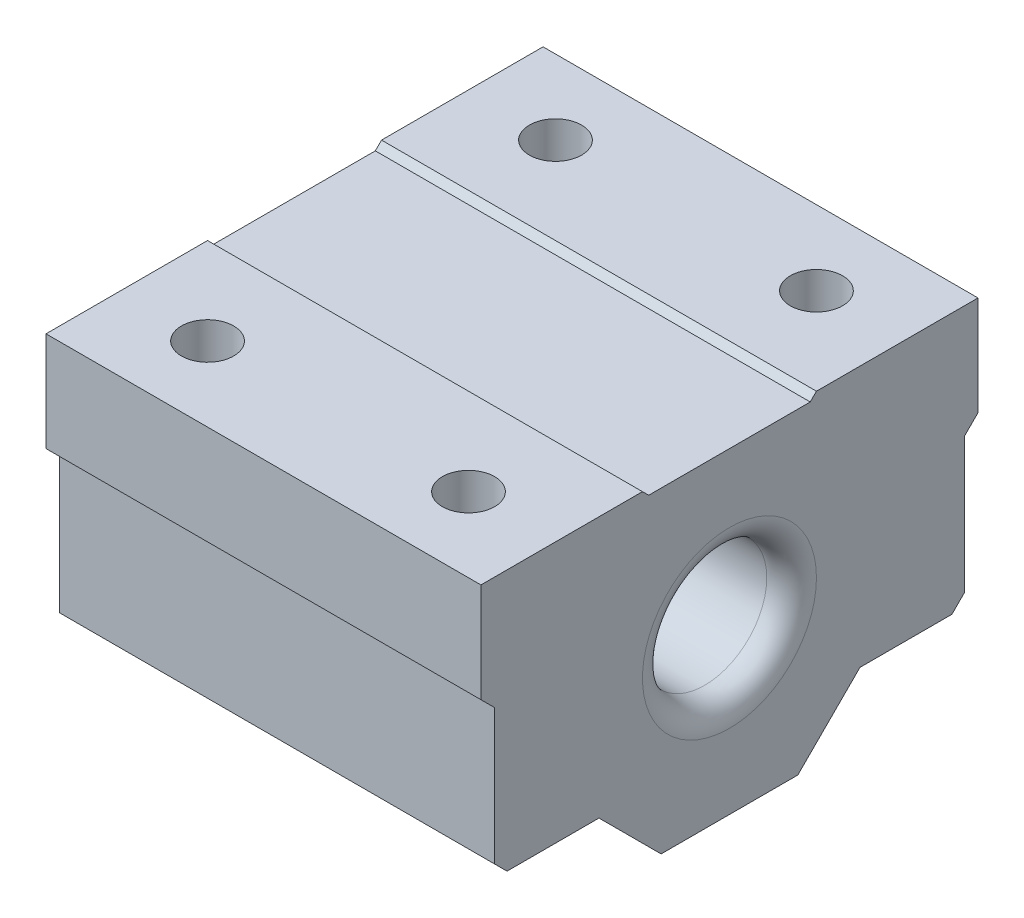
ISO-10303-21;
HEADER;
FILE_DESCRIPTION(('STEP AP214'),'2;1');
FILE_NAME('part.step','',(''),(''),'','','');
FILE_SCHEMA(('AUTOMOTIVE_DESIGN { 1 0 10303 214 1 1 1 1 }'));
ENDSEC;
DATA;
#1=APPLICATION_CONTEXT('core data for automotive mechanical design processes');
#2=APPLICATION_PROTOCOL_DEFINITION('international standard','automotive_design',2000,#1);
#3=PRODUCT_CONTEXT('',#1,'mechanical');
#4=PRODUCT('Part','Part','',(#3));
#5=PRODUCT_RELATED_PRODUCT_CATEGORY('part','',(#4));
#6=PRODUCT_DEFINITION_FORMATION('','',#4);
#7=PRODUCT_DEFINITION_CONTEXT('part definition',#1,'design');
#8=PRODUCT_DEFINITION('design','',#6,#7);
#9=PRODUCT_DEFINITION_SHAPE('','',#8);
#10=(LENGTH_UNIT() NAMED_UNIT(*) SI_UNIT(.MILLI.,.METRE.));
#11=(NAMED_UNIT(*) PLANE_ANGLE_UNIT() SI_UNIT($,.RADIAN.));
#12=(NAMED_UNIT(*) SI_UNIT($,.STERADIAN.) SOLID_ANGLE_UNIT());
#13=UNCERTAINTY_MEASURE_WITH_UNIT(LENGTH_MEASURE(1.E-05),#10,'distance_accuracy_value','');
#14=(GEOMETRIC_REPRESENTATION_CONTEXT(3) GLOBAL_UNCERTAINTY_ASSIGNED_CONTEXT((#13)) GLOBAL_UNIT_ASSIGNED_CONTEXT((#10,
#11,#12)) REPRESENTATION_CONTEXT('',''));
#15=CARTESIAN_POINT('',(0.,0.,0.));
#16=DIRECTION('',(0.,0.,1.));
#17=DIRECTION('',(1.,0.,0.));
#18=AXIS2_PLACEMENT_3D('',#15,#16,#17);
#19=CARTESIAN_POINT('',(35.,0.,0.));
#20=DIRECTION('',(1.,0.,0.));
#21=DIRECTION('',(0.,0.,-1.));
#22=AXIS2_PLACEMENT_3D('',#19,#20,#21);
#23=PLANE('',#22);
#24=CARTESIAN_POINT('',(35.,13.,-20.));
#25=DIRECTION('',(1.,0.,0.));
#26=DIRECTION('',(0.,0.,-1.));
#27=AXIS2_PLACEMENT_3D('',#24,#25,#26);
#28=CIRCLE('',#27,7.);
#29=CARTESIAN_POINT('',(35.,13.,-27.));
#30=VERTEX_POINT('',#29);
#31=EDGE_CURVE('E11',#30,#30,#28,.F.);
#32=ORIENTED_EDGE('',*,*,#31,.T.);
#33=EDGE_LOOP('',(#32));
#34=FACE_BOUND('',#33,.T.);
#35=DIRECTION('',(0.,0.,1.));
#36=VECTOR('',#35,1.);
#37=CARTESIAN_POINT('',(35.,26.,0.));
#38=LINE('',#37,#36);
#39=CARTESIAN_POINT('',(35.,26.,-13.));
#40=VERTEX_POINT('',#39);
#41=CARTESIAN_POINT('',(35.,26.,0.));
#42=VERTEX_POINT('',#41);
#43=EDGE_CURVE('E259',#40,#42,#38,.T.);
#44=ORIENTED_EDGE('',*,*,#43,.T.);
#45=DIRECTION('',(0.,-1.,0.));
#46=VECTOR('',#45,1.);
#47=CARTESIAN_POINT('',(35.,18.,0.));
#48=LINE('',#47,#46);
#49=CARTESIAN_POINT('',(35.,18.,0.));
#50=VERTEX_POINT('',#49);
#51=EDGE_CURVE('E135',#42,#50,#48,.T.);
#52=ORIENTED_EDGE('',*,*,#51,.T.);
#53=DIRECTION('',(0.,-0.707106781186546,-0.707106781186549));
#54=VECTOR('',#53,1.);
#55=CARTESIAN_POINT('',(35.,18.,0.));
#56=LINE('',#55,#54);
#57=CARTESIAN_POINT('',(35.,16.9,-1.1));
#58=VERTEX_POINT('',#57);
#59=EDGE_CURVE('E444',#50,#58,#56,.T.);
#60=ORIENTED_EDGE('',*,*,#59,.T.);
#61=DIRECTION('',(0.,-1.,0.));
#62=VECTOR('',#61,1.);
#63=CARTESIAN_POINT('',(35.,16.9,-1.1));
#64=LINE('',#63,#62);
#65=CARTESIAN_POINT('',(35.,6.,-1.1));
#66=VERTEX_POINT('',#65);
#67=EDGE_CURVE('E447',#58,#66,#64,.T.);
#68=ORIENTED_EDGE('',*,*,#67,.T.);
#69=DIRECTION('',(0.,-0.707106781186548,-0.707106781186547));
#70=VECTOR('',#69,1.);
#71=CARTESIAN_POINT('',(35.,6.,-1.1));
#72=LINE('',#71,#70);
#73=CARTESIAN_POINT('',(35.,5.,-2.1));
#74=VERTEX_POINT('',#73);
#75=EDGE_CURVE('E450',#66,#74,#72,.T.);
#76=ORIENTED_EDGE('',*,*,#75,.T.);
#77=DIRECTION('',(0.,0.,-1.));
#78=VECTOR('',#77,1.);
#79=CARTESIAN_POINT('',(35.,5.,-2.1));
#80=LINE('',#79,#78);
#81=CARTESIAN_POINT('',(35.,4.99999999999999,-9.50000000000003));
#82=VERTEX_POINT('',#81);
#83=EDGE_CURVE('E453',#74,#82,#80,.T.);
#84=ORIENTED_EDGE('',*,*,#83,.T.);
#85=DIRECTION('',(0.,-0.707106781186549,-0.707106781186546));
#86=VECTOR('',#85,1.);
#87=CARTESIAN_POINT('',(35.,4.99999999999999,-9.50000000000003));
#88=LINE('',#87,#86);
#89=CARTESIAN_POINT('',(35.,0.,-14.5));
#90=VERTEX_POINT('',#89);
#91=EDGE_CURVE('E456',#82,#90,#88,.T.);
#92=ORIENTED_EDGE('',*,*,#91,.T.);
#93=DIRECTION('',(0.,0.,-1.));
#94=VECTOR('',#93,1.);
#95=CARTESIAN_POINT('',(35.,0.,-14.5));
#96=LINE('',#95,#94);
#97=CARTESIAN_POINT('',(35.,0.,-25.5));
#98=VERTEX_POINT('',#97);
#99=EDGE_CURVE('E459',#90,#98,#96,.T.);
#100=ORIENTED_EDGE('',*,*,#99,.T.);
#101=DIRECTION('',(0.,0.707106781186549,-0.707106781186546));
#102=VECTOR('',#101,1.);
#103=CARTESIAN_POINT('',(35.,5.,-30.5));
#104=LINE('',#103,#102);
#105=CARTESIAN_POINT('',(35.,5.,-30.5));
#106=VERTEX_POINT('',#105);
#107=EDGE_CURVE('E462',#98,#106,#104,.T.);
#108=ORIENTED_EDGE('',*,*,#107,.T.);
#109=DIRECTION('',(0.,0.,-1.));
#110=VECTOR('',#109,1.);
#111=CARTESIAN_POINT('',(35.,5.,-37.9));
#112=LINE('',#111,#110);
#113=CARTESIAN_POINT('',(35.,5.,-37.9));
#114=VERTEX_POINT('',#113);
#115=EDGE_CURVE('E465',#106,#114,#112,.T.);
#116=ORIENTED_EDGE('',*,*,#115,.T.);
#117=DIRECTION('',(0.,0.707106781186547,-0.707106781186548));
#118=VECTOR('',#117,1.);
#119=CARTESIAN_POINT('',(35.,6.,-38.9));
#120=LINE('',#119,#118);
#121=CARTESIAN_POINT('',(35.,6.,-38.9));
#122=VERTEX_POINT('',#121);
#123=EDGE_CURVE('E468',#114,#122,#120,.T.);
#124=ORIENTED_EDGE('',*,*,#123,.T.);
#125=DIRECTION('',(0.,1.,0.));
#126=VECTOR('',#125,1.);
#127=CARTESIAN_POINT('',(35.,16.9,-38.9));
#128=LINE('',#127,#126);
#129=CARTESIAN_POINT('',(35.,16.9,-38.9));
#130=VERTEX_POINT('',#129);
#131=EDGE_CURVE('E471',#122,#130,#128,.T.);
#132=ORIENTED_EDGE('',*,*,#131,.T.);
#133=DIRECTION('',(0.,0.707106781186545,-0.70710678118655));
#134=VECTOR('',#133,1.);
#135=CARTESIAN_POINT('',(35.,18.,-40.));
#136=LINE('',#135,#134);
#137=CARTESIAN_POINT('',(35.,18.,-40.));
#138=VERTEX_POINT('',#137);
#139=EDGE_CURVE('E474',#130,#138,#136,.T.);
#140=ORIENTED_EDGE('',*,*,#139,.T.);
#141=DIRECTION('',(0.,1.,0.));
#142=VECTOR('',#141,1.);
#143=CARTESIAN_POINT('',(35.,18.,-40.));
#144=LINE('',#143,#142);
#145=CARTESIAN_POINT('',(35.,26.,-40.));
#146=VERTEX_POINT('',#145);
#147=EDGE_CURVE('E477',#138,#146,#144,.T.);
#148=ORIENTED_EDGE('',*,*,#147,.T.);
#149=DIRECTION('',(0.,0.,1.));
#150=VECTOR('',#149,1.);
#151=CARTESIAN_POINT('',(35.,26.,-27.));
#152=LINE('',#151,#150);
#153=CARTESIAN_POINT('',(35.,26.,-27.));
#154=VERTEX_POINT('',#153);
#155=EDGE_CURVE('E183',#146,#154,#152,.T.);
#156=ORIENTED_EDGE('',*,*,#155,.T.);
#157=DIRECTION('',(0.,-0.707106781186547,0.707106781186547));
#158=VECTOR('',#157,1.);
#159=CARTESIAN_POINT('',(35.,26.,-27.));
#160=LINE('',#159,#158);
#161=CARTESIAN_POINT('',(35.,25.5,-26.5));
#162=VERTEX_POINT('',#161);
#163=EDGE_CURVE('E178',#154,#162,#160,.T.);
#164=ORIENTED_EDGE('',*,*,#163,.T.);
#165=DIRECTION('',(0.,0.,1.));
#166=VECTOR('',#165,1.);
#167=CARTESIAN_POINT('',(35.,25.5,-26.5));
#168=LINE('',#167,#166);
#169=CARTESIAN_POINT('',(35.,25.5,-13.5));
#170=VERTEX_POINT('',#169);
#171=EDGE_CURVE('E181',#162,#170,#168,.T.);
#172=ORIENTED_EDGE('',*,*,#171,.T.);
#173=DIRECTION('',(0.,0.70710678118655,0.707106781186545));
#174=VECTOR('',#173,1.);
#175=CARTESIAN_POINT('',(35.,26.,-13.));
#176=LINE('',#175,#174);
#177=EDGE_CURVE('E62',#170,#40,#176,.T.);
#178=ORIENTED_EDGE('',*,*,#177,.T.);
#179=EDGE_LOOP('',(#44,#52,#60,#68,#76,#84,#92,#100,#108,#116,#124,#132,#140,#148,#156,#164,
#172,#178));
#180=FACE_BOUND('',#179,.T.);
#181=ADVANCED_FACE('F44',(#34,#180),#23,.T.);
#182=CARTESIAN_POINT('',(0.,0.,0.));
#183=DIRECTION('',(1.,0.,0.));
#184=DIRECTION('',(0.,0.,-1.));
#185=AXIS2_PLACEMENT_3D('',#182,#183,#184);
#186=PLANE('',#185);
#187=CARTESIAN_POINT('',(0.,13.,-20.));
#188=DIRECTION('',(1.,0.,0.));
#189=DIRECTION('',(0.,0.,-1.));
#190=AXIS2_PLACEMENT_3D('',#187,#188,#189);
#191=CIRCLE('',#190,7.);
#192=CARTESIAN_POINT('',(0.,13.,-27.));
#193=VERTEX_POINT('',#192);
#194=EDGE_CURVE('E353',#193,#193,#191,.T.);
#195=ORIENTED_EDGE('',*,*,#194,.T.);
#196=EDGE_LOOP('',(#195));
#197=FACE_BOUND('',#196,.T.);
#198=DIRECTION('',(0.,0.,1.));
#199=VECTOR('',#198,1.);
#200=CARTESIAN_POINT('',(0.,26.,0.));
#201=LINE('',#200,#199);
#202=CARTESIAN_POINT('',(0.,26.,-13.));
#203=VERTEX_POINT('',#202);
#204=CARTESIAN_POINT('',(0.,26.,0.));
#205=VERTEX_POINT('',#204);
#206=EDGE_CURVE('E206',#203,#205,#201,.T.);
#207=ORIENTED_EDGE('',*,*,#206,.F.);
#208=DIRECTION('',(0.,0.70710678118655,0.707106781186545));
#209=VECTOR('',#208,1.);
#210=CARTESIAN_POINT('',(0.,26.,-13.));
#211=LINE('',#210,#209);
#212=CARTESIAN_POINT('',(0.,25.5,-13.5));
#213=VERTEX_POINT('',#212);
#214=EDGE_CURVE('E126',#213,#203,#211,.T.);
#215=ORIENTED_EDGE('',*,*,#214,.F.);
#216=DIRECTION('',(0.,0.,1.));
#217=VECTOR('',#216,1.);
#218=CARTESIAN_POINT('',(0.,25.5,-13.5));
#219=LINE('',#218,#217);
#220=CARTESIAN_POINT('',(0.,25.5,-26.5));
#221=VERTEX_POINT('',#220);
#222=EDGE_CURVE('E120',#221,#213,#219,.T.);
#223=ORIENTED_EDGE('',*,*,#222,.F.);
#224=DIRECTION('',(0.,-0.707106781186547,0.707106781186547));
#225=VECTOR('',#224,1.);
#226=CARTESIAN_POINT('',(0.,26.,-27.));
#227=LINE('',#226,#225);
#228=CARTESIAN_POINT('',(0.,26.,-27.));
#229=VERTEX_POINT('',#228);
#230=EDGE_CURVE('E193',#229,#221,#227,.T.);
#231=ORIENTED_EDGE('',*,*,#230,.F.);
#232=DIRECTION('',(0.,0.,1.));
#233=VECTOR('',#232,1.);
#234=CARTESIAN_POINT('',(0.,26.,-27.));
#235=LINE('',#234,#233);
#236=CARTESIAN_POINT('',(0.,26.,-40.));
#237=VERTEX_POINT('',#236);
#238=EDGE_CURVE('E250',#237,#229,#235,.T.);
#239=ORIENTED_EDGE('',*,*,#238,.F.);
#240=DIRECTION('',(0.,1.,0.));
#241=VECTOR('',#240,1.);
#242=CARTESIAN_POINT('',(0.,18.,-40.));
#243=LINE('',#242,#241);
#244=CARTESIAN_POINT('',(0.,18.,-40.));
#245=VERTEX_POINT('',#244);
#246=EDGE_CURVE('E247',#245,#237,#243,.T.);
#247=ORIENTED_EDGE('',*,*,#246,.F.);
#248=DIRECTION('',(0.,0.707106781186545,-0.70710678118655));
#249=VECTOR('',#248,1.);
#250=CARTESIAN_POINT('',(0.,18.,-40.));
#251=LINE('',#250,#249);
#252=CARTESIAN_POINT('',(0.,16.9,-38.9));
#253=VERTEX_POINT('',#252);
#254=EDGE_CURVE('E244',#253,#245,#251,.T.);
#255=ORIENTED_EDGE('',*,*,#254,.F.);
#256=DIRECTION('',(0.,1.,0.));
#257=VECTOR('',#256,1.);
#258=CARTESIAN_POINT('',(0.,16.9,-38.9));
#259=LINE('',#258,#257);
#260=CARTESIAN_POINT('',(0.,6.,-38.9));
#261=VERTEX_POINT('',#260);
#262=EDGE_CURVE('E241',#261,#253,#259,.T.);
#263=ORIENTED_EDGE('',*,*,#262,.F.);
#264=DIRECTION('',(0.,0.707106781186547,-0.707106781186548));
#265=VECTOR('',#264,1.);
#266=CARTESIAN_POINT('',(0.,6.,-38.9));
#267=LINE('',#266,#265);
#268=CARTESIAN_POINT('',(0.,5.,-37.9));
#269=VERTEX_POINT('',#268);
#270=EDGE_CURVE('E238',#269,#261,#267,.T.);
#271=ORIENTED_EDGE('',*,*,#270,.F.);
#272=DIRECTION('',(0.,0.,-1.));
#273=VECTOR('',#272,1.);
#274=CARTESIAN_POINT('',(0.,5.,-37.9));
#275=LINE('',#274,#273);
#276=CARTESIAN_POINT('',(0.,5.,-30.5));
#277=VERTEX_POINT('',#276);
#278=EDGE_CURVE('E235',#277,#269,#275,.T.);
#279=ORIENTED_EDGE('',*,*,#278,.F.);
#280=DIRECTION('',(0.,0.707106781186549,-0.707106781186546));
#281=VECTOR('',#280,1.);
#282=CARTESIAN_POINT('',(0.,5.,-30.5));
#283=LINE('',#282,#281);
#284=CARTESIAN_POINT('',(0.,0.,-25.5));
#285=VERTEX_POINT('',#284);
#286=EDGE_CURVE('E232',#285,#277,#283,.T.);
#287=ORIENTED_EDGE('',*,*,#286,.F.);
#288=DIRECTION('',(0.,0.,-1.));
#289=VECTOR('',#288,1.);
#290=CARTESIAN_POINT('',(0.,0.,-14.5));
#291=LINE('',#290,#289);
#292=CARTESIAN_POINT('',(0.,0.,-14.5));
#293=VERTEX_POINT('',#292);
#294=EDGE_CURVE('E229',#293,#285,#291,.T.);
#295=ORIENTED_EDGE('',*,*,#294,.F.);
#296=DIRECTION('',(0.,-0.707106781186549,-0.707106781186546));
#297=VECTOR('',#296,1.);
#298=CARTESIAN_POINT('',(0.,4.99999999999999,-9.50000000000003));
#299=LINE('',#298,#297);
#300=CARTESIAN_POINT('',(0.,4.99999999999999,-9.50000000000003));
#301=VERTEX_POINT('',#300);
#302=EDGE_CURVE('E226',#301,#293,#299,.T.);
#303=ORIENTED_EDGE('',*,*,#302,.F.);
#304=DIRECTION('',(0.,0.,-1.));
#305=VECTOR('',#304,1.);
#306=CARTESIAN_POINT('',(0.,5.,-2.1));
#307=LINE('',#306,#305);
#308=CARTESIAN_POINT('',(0.,5.,-2.1));
#309=VERTEX_POINT('',#308);
#310=EDGE_CURVE('E223',#309,#301,#307,.T.);
#311=ORIENTED_EDGE('',*,*,#310,.F.);
#312=DIRECTION('',(0.,-0.707106781186548,-0.707106781186547));
#313=VECTOR('',#312,1.);
#314=CARTESIAN_POINT('',(0.,6.,-1.1));
#315=LINE('',#314,#313);
#316=CARTESIAN_POINT('',(0.,6.,-1.1));
#317=VERTEX_POINT('',#316);
#318=EDGE_CURVE('E220',#317,#309,#315,.T.);
#319=ORIENTED_EDGE('',*,*,#318,.F.);
#320=DIRECTION('',(0.,-1.,0.));
#321=VECTOR('',#320,1.);
#322=CARTESIAN_POINT('',(0.,16.9,-1.1));
#323=LINE('',#322,#321);
#324=CARTESIAN_POINT('',(0.,16.9,-1.1));
#325=VERTEX_POINT('',#324);
#326=EDGE_CURVE('E217',#325,#317,#323,.T.);
#327=ORIENTED_EDGE('',*,*,#326,.F.);
#328=DIRECTION('',(0.,-0.707106781186546,-0.707106781186549));
#329=VECTOR('',#328,1.);
#330=CARTESIAN_POINT('',(0.,18.,0.));
#331=LINE('',#330,#329);
#332=CARTESIAN_POINT('',(0.,18.,0.));
#333=VERTEX_POINT('',#332);
#334=EDGE_CURVE('E214',#333,#325,#331,.T.);
#335=ORIENTED_EDGE('',*,*,#334,.F.);
#336=DIRECTION('',(0.,-1.,0.));
#337=VECTOR('',#336,1.);
#338=CARTESIAN_POINT('',(0.,18.,0.));
#339=LINE('',#338,#337);
#340=EDGE_CURVE('E210',#205,#333,#339,.T.);
#341=ORIENTED_EDGE('',*,*,#340,.F.);
#342=EDGE_LOOP('',(#207,#215,#223,#231,#239,#247,#255,#263,#271,#279,#287,#295,#303,#311,#319,
#327,#335,#341));
#343=FACE_BOUND('',#342,.T.);
#344=ADVANCED_FACE('F373',(#197,#343),#186,.F.);
#345=CARTESIAN_POINT('',(35.,26.,0.));
#346=DIRECTION('',(0.,-1.,0.));
#347=DIRECTION('',(0.,0.,-1.));
#348=AXIS2_PLACEMENT_3D('',#345,#346,#347);
#349=PLANE('',#348);
#350=CARTESIAN_POINT('',(28.,26.,-6.00000000000001));
#351=DIRECTION('',(0.,1.,0.));
#352=DIRECTION('',(0.,0.,1.));
#353=AXIS2_PLACEMENT_3D('',#350,#351,#352);
#354=CIRCLE('',#353,2.1);
#355=CARTESIAN_POINT('',(28.,26.,-3.9));
#356=VERTEX_POINT('',#355);
#357=EDGE_CURVE('E431',#356,#356,#354,.T.);
#358=ORIENTED_EDGE('',*,*,#357,.F.);
#359=EDGE_LOOP('',(#358));
#360=FACE_BOUND('',#359,.T.);
#361=CARTESIAN_POINT('',(7.,26.,-6.));
#362=DIRECTION('',(0.,1.,0.));
#363=DIRECTION('',(0.,0.,1.));
#364=AXIS2_PLACEMENT_3D('',#361,#362,#363);
#365=CIRCLE('',#364,2.1);
#366=CARTESIAN_POINT('',(7.,26.,-3.9));
#367=VERTEX_POINT('',#366);
#368=EDGE_CURVE('E211',#367,#367,#365,.T.);
#369=ORIENTED_EDGE('',*,*,#368,.F.);
#370=EDGE_LOOP('',(#369));
#371=FACE_BOUND('',#370,.T.);
#372=ORIENTED_EDGE('',*,*,#206,.T.);
#373=DIRECTION('',(-1.,0.,0.));
#374=VECTOR('',#373,1.);
#375=CARTESIAN_POINT('',(35.,26.,0.));
#376=LINE('',#375,#374);
#377=EDGE_CURVE('E318',#42,#205,#376,.T.);
#378=ORIENTED_EDGE('',*,*,#377,.F.);
#379=ORIENTED_EDGE('',*,*,#43,.F.);
#380=DIRECTION('',(-1.,0.,0.));
#381=VECTOR('',#380,1.);
#382=CARTESIAN_POINT('',(35.,26.,-13.));
#383=LINE('',#382,#381);
#384=EDGE_CURVE('E202',#40,#203,#383,.T.);
#385=ORIENTED_EDGE('',*,*,#384,.T.);
#386=EDGE_LOOP('',(#372,#378,#379,#385));
#387=FACE_BOUND('',#386,.T.);
#388=ADVANCED_FACE('F376',(#360,#371,#387),#349,.F.);
#389=CARTESIAN_POINT('',(35.,18.,0.));
#390=DIRECTION('',(0.,0.,-1.));
#391=DIRECTION('',(-1.,0.,0.));
#392=AXIS2_PLACEMENT_3D('',#389,#390,#391);
#393=PLANE('',#392);
#394=ORIENTED_EDGE('',*,*,#340,.T.);
#395=DIRECTION('',(-1.,0.,0.));
#396=VECTOR('',#395,1.);
#397=CARTESIAN_POINT('',(35.,18.,0.));
#398=LINE('',#397,#396);
#399=EDGE_CURVE('E314',#50,#333,#398,.T.);
#400=ORIENTED_EDGE('',*,*,#399,.F.);
#401=ORIENTED_EDGE('',*,*,#51,.F.);
#402=ORIENTED_EDGE('',*,*,#377,.T.);
#403=EDGE_LOOP('',(#394,#400,#401,#402));
#404=FACE_BOUND('',#403,.T.);
#405=ADVANCED_FACE('F542',(#404),#393,.F.);
#406=CARTESIAN_POINT('',(35.,18.,0.));
#407=DIRECTION('',(0.,0.707106781186549,-0.707106781186546));
#408=DIRECTION('',(0.,0.707106781186546,0.707106781186549));
#409=AXIS2_PLACEMENT_3D('',#406,#407,#408);
#410=PLANE('',#409);
#411=ORIENTED_EDGE('',*,*,#334,.T.);
#412=DIRECTION('',(-1.,0.,0.));
#413=VECTOR('',#412,1.);
#414=CARTESIAN_POINT('',(35.,16.9,-1.1));
#415=LINE('',#414,#413);
#416=EDGE_CURVE('E310',#58,#325,#415,.T.);
#417=ORIENTED_EDGE('',*,*,#416,.F.);
#418=ORIENTED_EDGE('',*,*,#59,.F.);
#419=ORIENTED_EDGE('',*,*,#399,.T.);
#420=EDGE_LOOP('',(#411,#417,#418,#419));
#421=FACE_BOUND('',#420,.T.);
#422=ADVANCED_FACE('F541',(#421),#410,.F.);
#423=CARTESIAN_POINT('',(35.,16.9,-1.1));
#424=DIRECTION('',(0.,0.,-1.));
#425=DIRECTION('',(0.,1.,0.));
#426=AXIS2_PLACEMENT_3D('',#423,#424,#425);
#427=PLANE('',#426);
#428=ORIENTED_EDGE('',*,*,#326,.T.);
#429=DIRECTION('',(-1.,0.,0.));
#430=VECTOR('',#429,1.);
#431=CARTESIAN_POINT('',(35.,6.,-1.1));
#432=LINE('',#431,#430);
#433=EDGE_CURVE('E306',#66,#317,#432,.T.);
#434=ORIENTED_EDGE('',*,*,#433,.F.);
#435=ORIENTED_EDGE('',*,*,#67,.F.);
#436=ORIENTED_EDGE('',*,*,#416,.T.);
#437=EDGE_LOOP('',(#428,#434,#435,#436));
#438=FACE_BOUND('',#437,.T.);
#439=ADVANCED_FACE('F536',(#438),#427,.F.);
#440=CARTESIAN_POINT('',(35.,6.,-1.1));
#441=DIRECTION('',(0.,0.707106781186547,-0.707106781186548));
#442=DIRECTION('',(0.,0.707106781186548,0.707106781186547));
#443=AXIS2_PLACEMENT_3D('',#440,#441,#442);
#444=PLANE('',#443);
#445=ORIENTED_EDGE('',*,*,#318,.T.);
#446=DIRECTION('',(-1.,0.,0.));
#447=VECTOR('',#446,1.);
#448=CARTESIAN_POINT('',(35.,5.,-2.1));
#449=LINE('',#448,#447);
#450=EDGE_CURVE('E302',#74,#309,#449,.T.);
#451=ORIENTED_EDGE('',*,*,#450,.F.);
#452=ORIENTED_EDGE('',*,*,#75,.F.);
#453=ORIENTED_EDGE('',*,*,#433,.T.);
#454=EDGE_LOOP('',(#445,#451,#452,#453));
#455=FACE_BOUND('',#454,.T.);
#456=ADVANCED_FACE('F532',(#455),#444,.F.);
#457=CARTESIAN_POINT('',(35.,5.,-2.1));
#458=DIRECTION('',(0.,1.,0.));
#459=DIRECTION('',(0.,0.,1.));
#460=AXIS2_PLACEMENT_3D('',#457,#458,#459);
#461=PLANE('',#460);
#462=CARTESIAN_POINT('',(7.,4.99999999999999,-6.));
#463=DIRECTION('',(0.,1.,0.));
#464=DIRECTION('',(0.,0.,1.));
#465=AXIS2_PLACEMENT_3D('',#462,#463,#464);
#466=CIRCLE('',#465,3.09999999999999);
#467=CARTESIAN_POINT('',(7.,5.,-2.90000000000001));
#468=VERTEX_POINT('',#467);
#469=EDGE_CURVE('E325',#468,#468,#466,.T.);
#470=ORIENTED_EDGE('',*,*,#469,.T.);
#471=EDGE_LOOP('',(#470));
#472=FACE_BOUND('',#471,.T.);
#473=CARTESIAN_POINT('',(28.,4.99999999999999,-6.00000000000001));
#474=DIRECTION('',(0.,1.,0.));
#475=DIRECTION('',(0.,0.,1.));
#476=AXIS2_PLACEMENT_3D('',#473,#474,#475);
#477=CIRCLE('',#476,3.09999999999999);
#478=CARTESIAN_POINT('',(28.,5.,-2.90000000000001));
#479=VERTEX_POINT('',#478);
#480=EDGE_CURVE('E321',#479,#479,#477,.T.);
#481=ORIENTED_EDGE('',*,*,#480,.T.);
#482=EDGE_LOOP('',(#481));
#483=FACE_BOUND('',#482,.T.);
#484=ORIENTED_EDGE('',*,*,#310,.T.);
#485=DIRECTION('',(-1.,0.,0.));
#486=VECTOR('',#485,1.);
#487=CARTESIAN_POINT('',(35.,4.99999999999999,-9.50000000000003));
#488=LINE('',#487,#486);
#489=EDGE_CURVE('E298',#82,#301,#488,.T.);
#490=ORIENTED_EDGE('',*,*,#489,.F.);
#491=ORIENTED_EDGE('',*,*,#83,.F.);
#492=ORIENTED_EDGE('',*,*,#450,.T.);
#493=EDGE_LOOP('',(#484,#490,#491,#492));
#494=FACE_BOUND('',#493,.T.);
#495=ADVANCED_FACE('F528',(#472,#483,#494),#461,.F.);
#496=CARTESIAN_POINT('',(35.,4.99999999999999,-9.50000000000003));
#497=DIRECTION('',(0.,0.707106781186546,-0.707106781186549));
#498=DIRECTION('',(0.,0.707106781186549,0.707106781186546));
#499=AXIS2_PLACEMENT_3D('',#496,#497,#498);
#500=PLANE('',#499);
#501=ORIENTED_EDGE('',*,*,#302,.T.);
#502=DIRECTION('',(-1.,0.,0.));
#503=VECTOR('',#502,1.);
#504=CARTESIAN_POINT('',(35.,0.,-14.5));
#505=LINE('',#504,#503);
#506=EDGE_CURVE('E294',#90,#293,#505,.T.);
#507=ORIENTED_EDGE('',*,*,#506,.F.);
#508=ORIENTED_EDGE('',*,*,#91,.F.);
#509=ORIENTED_EDGE('',*,*,#489,.T.);
#510=EDGE_LOOP('',(#501,#507,#508,#509));
#511=FACE_BOUND('',#510,.T.);
#512=ADVANCED_FACE('F523',(#511),#500,.F.);
#513=CARTESIAN_POINT('',(35.,0.,-14.5));
#514=DIRECTION('',(0.,1.,0.));
#515=DIRECTION('',(0.,0.,1.));
#516=AXIS2_PLACEMENT_3D('',#513,#514,#515);
#517=PLANE('',#516);
#518=ORIENTED_EDGE('',*,*,#294,.T.);
#519=DIRECTION('',(-1.,0.,0.));
#520=VECTOR('',#519,1.);
#521=CARTESIAN_POINT('',(35.,0.,-25.5));
#522=LINE('',#521,#520);
#523=EDGE_CURVE('E290',#98,#285,#522,.T.);
#524=ORIENTED_EDGE('',*,*,#523,.F.);
#525=ORIENTED_EDGE('',*,*,#99,.F.);
#526=ORIENTED_EDGE('',*,*,#506,.T.);
#527=EDGE_LOOP('',(#518,#524,#525,#526));
#528=FACE_BOUND('',#527,.T.);
#529=ADVANCED_FACE('F517',(#528),#517,.F.);
#530=CARTESIAN_POINT('',(35.,5.,-30.5));
#531=DIRECTION('',(0.,0.707106781186546,0.707106781186549));
#532=DIRECTION('',(0.,-0.707106781186549,0.707106781186546));
#533=AXIS2_PLACEMENT_3D('',#530,#531,#532);
#534=PLANE('',#533);
#535=ORIENTED_EDGE('',*,*,#286,.T.);
#536=DIRECTION('',(-1.,0.,0.));
#537=VECTOR('',#536,1.);
#538=CARTESIAN_POINT('',(35.,5.,-30.5));
#539=LINE('',#538,#537);
#540=EDGE_CURVE('E286',#106,#277,#539,.T.);
#541=ORIENTED_EDGE('',*,*,#540,.F.);
#542=ORIENTED_EDGE('',*,*,#107,.F.);
#543=ORIENTED_EDGE('',*,*,#523,.T.);
#544=EDGE_LOOP('',(#535,#541,#542,#543));
#545=FACE_BOUND('',#544,.T.);
#546=ADVANCED_FACE('F513',(#545),#534,.F.);
#547=CARTESIAN_POINT('',(35.,5.,-37.9));
#548=DIRECTION('',(0.,1.,0.));
#549=DIRECTION('',(0.,0.,1.));
#550=AXIS2_PLACEMENT_3D('',#547,#548,#549);
#551=PLANE('',#550);
#552=CARTESIAN_POINT('',(28.,5.,-34.));
#553=DIRECTION('',(0.,1.,0.));
#554=DIRECTION('',(0.,0.,1.));
#555=AXIS2_PLACEMENT_3D('',#552,#553,#554);
#556=CIRCLE('',#555,3.1);
#557=CARTESIAN_POINT('',(28.,5.,-30.9));
#558=VERTEX_POINT('',#557);
#559=EDGE_CURVE('E341',#558,#558,#556,.T.);
#560=ORIENTED_EDGE('',*,*,#559,.T.);
#561=EDGE_LOOP('',(#560));
#562=FACE_BOUND('',#561,.T.);
#563=CARTESIAN_POINT('',(7.,5.,-34.));
#564=DIRECTION('',(0.,1.,0.));
#565=DIRECTION('',(0.,0.,1.));
#566=AXIS2_PLACEMENT_3D('',#563,#564,#565);
#567=CIRCLE('',#566,3.1);
#568=CARTESIAN_POINT('',(7.,5.,-30.9));
#569=VERTEX_POINT('',#568);
#570=EDGE_CURVE('E337',#569,#569,#567,.T.);
#571=ORIENTED_EDGE('',*,*,#570,.T.);
#572=EDGE_LOOP('',(#571));
#573=FACE_BOUND('',#572,.T.);
#574=ORIENTED_EDGE('',*,*,#278,.T.);
#575=DIRECTION('',(-1.,0.,0.));
#576=VECTOR('',#575,1.);
#577=CARTESIAN_POINT('',(35.,5.,-37.9));
#578=LINE('',#577,#576);
#579=EDGE_CURVE('E282',#114,#269,#578,.T.);
#580=ORIENTED_EDGE('',*,*,#579,.F.);
#581=ORIENTED_EDGE('',*,*,#115,.F.);
#582=ORIENTED_EDGE('',*,*,#540,.T.);
#583=EDGE_LOOP('',(#574,#580,#581,#582));
#584=FACE_BOUND('',#583,.T.);
#585=ADVANCED_FACE('F508',(#562,#573,#584),#551,.F.);
#586=CARTESIAN_POINT('',(35.,6.,-38.9));
#587=DIRECTION('',(0.,0.707106781186548,0.707106781186547));
#588=DIRECTION('',(0.,-0.707106781186547,0.707106781186548));
#589=AXIS2_PLACEMENT_3D('',#586,#587,#588);
#590=PLANE('',#589);
#591=ORIENTED_EDGE('',*,*,#270,.T.);
#592=DIRECTION('',(-1.,0.,0.));
#593=VECTOR('',#592,1.);
#594=CARTESIAN_POINT('',(35.,6.,-38.9));
#595=LINE('',#594,#593);
#596=EDGE_CURVE('E278',#122,#261,#595,.T.);
#597=ORIENTED_EDGE('',*,*,#596,.F.);
#598=ORIENTED_EDGE('',*,*,#123,.F.);
#599=ORIENTED_EDGE('',*,*,#579,.T.);
#600=EDGE_LOOP('',(#591,#597,#598,#599));
#601=FACE_BOUND('',#600,.T.);
#602=ADVANCED_FACE('F502',(#601),#590,.F.);
#603=CARTESIAN_POINT('',(35.,16.9,-38.9));
#604=DIRECTION('',(0.,0.,1.));
#605=DIRECTION('',(0.,-1.,0.));
#606=AXIS2_PLACEMENT_3D('',#603,#604,#605);
#607=PLANE('',#606);
#608=ORIENTED_EDGE('',*,*,#262,.T.);
#609=DIRECTION('',(-1.,0.,0.));
#610=VECTOR('',#609,1.);
#611=CARTESIAN_POINT('',(35.,16.9,-38.9));
#612=LINE('',#611,#610);
#613=EDGE_CURVE('E274',#130,#253,#612,.T.);
#614=ORIENTED_EDGE('',*,*,#613,.F.);
#615=ORIENTED_EDGE('',*,*,#131,.F.);
#616=ORIENTED_EDGE('',*,*,#596,.T.);
#617=EDGE_LOOP('',(#608,#614,#615,#616));
#618=FACE_BOUND('',#617,.T.);
#619=ADVANCED_FACE('F498',(#618),#607,.F.);
#620=CARTESIAN_POINT('',(35.,18.,-40.));
#621=DIRECTION('',(0.,0.70710678118655,0.707106781186545));
#622=DIRECTION('',(0.,-0.707106781186545,0.70710678118655));
#623=AXIS2_PLACEMENT_3D('',#620,#621,#622);
#624=PLANE('',#623);
#625=ORIENTED_EDGE('',*,*,#254,.T.);
#626=DIRECTION('',(-1.,0.,0.));
#627=VECTOR('',#626,1.);
#628=CARTESIAN_POINT('',(35.,18.,-40.));
#629=LINE('',#628,#627);
#630=EDGE_CURVE('E270',#138,#245,#629,.T.);
#631=ORIENTED_EDGE('',*,*,#630,.F.);
#632=ORIENTED_EDGE('',*,*,#139,.F.);
#633=ORIENTED_EDGE('',*,*,#613,.T.);
#634=EDGE_LOOP('',(#625,#631,#632,#633));
#635=FACE_BOUND('',#634,.T.);
#636=ADVANCED_FACE('F494',(#635),#624,.F.);
#637=CARTESIAN_POINT('',(35.,18.,-40.));
#638=DIRECTION('',(0.,0.,1.));
#639=DIRECTION('',(1.,0.,0.));
#640=AXIS2_PLACEMENT_3D('',#637,#638,#639);
#641=PLANE('',#640);
#642=ORIENTED_EDGE('',*,*,#246,.T.);
#643=DIRECTION('',(-1.,0.,0.));
#644=VECTOR('',#643,1.);
#645=CARTESIAN_POINT('',(35.,26.,-40.));
#646=LINE('',#645,#644);
#647=EDGE_CURVE('E266',#146,#237,#646,.T.);
#648=ORIENTED_EDGE('',*,*,#647,.F.);
#649=ORIENTED_EDGE('',*,*,#147,.F.);
#650=ORIENTED_EDGE('',*,*,#630,.T.);
#651=EDGE_LOOP('',(#642,#648,#649,#650));
#652=FACE_BOUND('',#651,.T.);
#653=ADVANCED_FACE('F485',(#652),#641,.F.);
#654=CARTESIAN_POINT('',(35.,26.,-27.));
#655=DIRECTION('',(0.,-1.,0.));
#656=DIRECTION('',(0.,0.,-1.));
#657=AXIS2_PLACEMENT_3D('',#654,#655,#656);
#658=PLANE('',#657);
#659=CARTESIAN_POINT('',(7.,26.,-34.));
#660=DIRECTION('',(0.,1.,0.));
#661=DIRECTION('',(0.,0.,1.));
#662=AXIS2_PLACEMENT_3D('',#659,#660,#661);
#663=CIRCLE('',#662,2.1);
#664=CARTESIAN_POINT('',(7.,26.,-31.9));
#665=VERTEX_POINT('',#664);
#666=EDGE_CURVE('E424',#665,#665,#663,.T.);
#667=ORIENTED_EDGE('',*,*,#666,.F.);
#668=EDGE_LOOP('',(#667));
#669=FACE_BOUND('',#668,.T.);
#670=CARTESIAN_POINT('',(28.,26.,-34.));
#671=DIRECTION('',(0.,1.,0.));
#672=DIRECTION('',(0.,0.,1.));
#673=AXIS2_PLACEMENT_3D('',#670,#671,#672);
#674=CIRCLE('',#673,2.1);
#675=CARTESIAN_POINT('',(28.,26.,-31.9));
#676=VERTEX_POINT('',#675);
#677=EDGE_CURVE('E427',#676,#676,#674,.T.);
#678=ORIENTED_EDGE('',*,*,#677,.F.);
#679=EDGE_LOOP('',(#678));
#680=FACE_BOUND('',#679,.T.);
#681=ORIENTED_EDGE('',*,*,#238,.T.);
#682=DIRECTION('',(-1.,0.,0.));
#683=VECTOR('',#682,1.);
#684=CARTESIAN_POINT('',(35.,26.,-27.));
#685=LINE('',#684,#683);
#686=EDGE_CURVE('E195',#154,#229,#685,.T.);
#687=ORIENTED_EDGE('',*,*,#686,.F.);
#688=ORIENTED_EDGE('',*,*,#155,.F.);
#689=ORIENTED_EDGE('',*,*,#647,.T.);
#690=EDGE_LOOP('',(#681,#687,#688,#689));
#691=FACE_BOUND('',#690,.T.);
#692=ADVANCED_FACE('F489',(#669,#680,#691),#658,.F.);
#693=CARTESIAN_POINT('',(35.,26.,-27.));
#694=DIRECTION('',(0.,-0.707106781186548,-0.707106781186548));
#695=DIRECTION('',(0.,0.707106781186548,-0.707106781186548));
#696=AXIS2_PLACEMENT_3D('',#693,#694,#695);
#697=PLANE('',#696);
#698=ORIENTED_EDGE('',*,*,#230,.T.);
#699=DIRECTION('',(-1.,0.,0.));
#700=VECTOR('',#699,1.);
#701=CARTESIAN_POINT('',(35.,25.5,-26.5));
#702=LINE('',#701,#700);
#703=EDGE_CURVE('E190',#162,#221,#702,.T.);
#704=ORIENTED_EDGE('',*,*,#703,.F.);
#705=ORIENTED_EDGE('',*,*,#163,.F.);
#706=ORIENTED_EDGE('',*,*,#686,.T.);
#707=EDGE_LOOP('',(#698,#704,#705,#706));
#708=FACE_BOUND('',#707,.T.);
#709=ADVANCED_FACE('F191',(#708),#697,.F.);
#710=CARTESIAN_POINT('',(35.,25.5,-13.5));
#711=DIRECTION('',(0.,-1.,0.));
#712=DIRECTION('',(0.,0.,-1.));
#713=AXIS2_PLACEMENT_3D('',#710,#711,#712);
#714=PLANE('',#713);
#715=ORIENTED_EDGE('',*,*,#222,.T.);
#716=DIRECTION('',(-1.,0.,0.));
#717=VECTOR('',#716,1.);
#718=CARTESIAN_POINT('',(35.,25.5,-13.5));
#719=LINE('',#718,#717);
#720=EDGE_CURVE('E196',#170,#213,#719,.T.);
#721=ORIENTED_EDGE('',*,*,#720,.F.);
#722=ORIENTED_EDGE('',*,*,#171,.F.);
#723=ORIENTED_EDGE('',*,*,#703,.T.);
#724=EDGE_LOOP('',(#715,#721,#722,#723));
#725=FACE_BOUND('',#724,.T.);
#726=ADVANCED_FACE('F198',(#725),#714,.F.);
#727=CARTESIAN_POINT('',(35.,26.,-13.));
#728=DIRECTION('',(0.,-0.707106781186545,0.70710678118655));
#729=DIRECTION('',(0.,-0.70710678118655,-0.707106781186545));
#730=AXIS2_PLACEMENT_3D('',#727,#728,#729);
#731=PLANE('',#730);
#732=ORIENTED_EDGE('',*,*,#214,.T.);
#733=ORIENTED_EDGE('',*,*,#384,.F.);
#734=ORIENTED_EDGE('',*,*,#177,.F.);
#735=ORIENTED_EDGE('',*,*,#720,.T.);
#736=EDGE_LOOP('',(#732,#733,#734,#735));
#737=FACE_BOUND('',#736,.T.);
#738=ADVANCED_FACE('F383',(#737),#731,.F.);
#739=CARTESIAN_POINT('',(35.,13.,-20.));
#740=DIRECTION('',(-1.,0.,0.));
#741=DIRECTION('',(0.,0.,1.));
#742=AXIS2_PLACEMENT_3D('',#739,#740,#741);
#743=CYLINDRICAL_SURFACE('',#742,5.);
#744=CARTESIAN_POINT('',(2.,13.,-20.));
#745=DIRECTION('',(1.,0.,0.));
#746=DIRECTION('',(0.,0.,-1.));
#747=AXIS2_PLACEMENT_3D('',#744,#745,#746);
#748=CIRCLE('',#747,5.);
#749=CARTESIAN_POINT('',(2.,13.,-25.));
#750=VERTEX_POINT('',#749);
#751=EDGE_CURVE('E54',#750,#750,#748,.F.);
#752=ORIENTED_EDGE('',*,*,#751,.T.);
#753=EDGE_LOOP('',(#752));
#754=FACE_BOUND('',#753,.T.);
#755=CARTESIAN_POINT('',(33.,13.,-20.));
#756=DIRECTION('',(1.,0.,0.));
#757=DIRECTION('',(0.,0.,-1.));
#758=AXIS2_PLACEMENT_3D('',#755,#756,#757);
#759=CIRCLE('',#758,5.);
#760=CARTESIAN_POINT('',(33.,13.,-25.));
#761=VERTEX_POINT('',#760);
#762=EDGE_CURVE('E357',#761,#761,#759,.T.);
#763=ORIENTED_EDGE('',*,*,#762,.T.);
#764=EDGE_LOOP('',(#763));
#765=FACE_BOUND('',#764,.T.);
#766=ADVANCED_FACE('F364',(#754,#765),#743,.F.);
#767=CARTESIAN_POINT('',(7.,26.,-6.));
#768=DIRECTION('',(0.,1.,0.));
#769=DIRECTION('',(0.,0.,1.));
#770=AXIS2_PLACEMENT_3D('',#767,#768,#769);
#771=CYLINDRICAL_SURFACE('',#770,2.1);
#772=CARTESIAN_POINT('',(7.,6.,-6.));
#773=DIRECTION('',(0.,1.,0.));
#774=DIRECTION('',(0.,0.,1.));
#775=AXIS2_PLACEMENT_3D('',#772,#773,#774);
#776=CIRCLE('',#775,2.1);
#777=CARTESIAN_POINT('',(7.,6.,-3.90000000000001));
#778=VERTEX_POINT('',#777);
#779=EDGE_CURVE('E329',#778,#778,#776,.F.);
#780=ORIENTED_EDGE('',*,*,#779,.T.);
#781=EDGE_LOOP('',(#780));
#782=FACE_BOUND('',#781,.T.);
#783=ORIENTED_EDGE('',*,*,#368,.T.);
#784=EDGE_LOOP('',(#783));
#785=FACE_BOUND('',#784,.T.);
#786=ADVANCED_FACE('F390',(#782,#785),#771,.F.);
#787=CARTESIAN_POINT('',(28.,26.,-6.00000000000001));
#788=DIRECTION('',(0.,1.,0.));
#789=DIRECTION('',(0.,0.,1.));
#790=AXIS2_PLACEMENT_3D('',#787,#788,#789);
#791=CYLINDRICAL_SURFACE('',#790,2.1);
#792=CARTESIAN_POINT('',(28.,6.,-6.00000000000001));
#793=DIRECTION('',(0.,1.,0.));
#794=DIRECTION('',(0.,0.,1.));
#795=AXIS2_PLACEMENT_3D('',#792,#793,#794);
#796=CIRCLE('',#795,2.1);
#797=CARTESIAN_POINT('',(28.,6.,-3.90000000000001));
#798=VERTEX_POINT('',#797);
#799=EDGE_CURVE('E333',#798,#798,#796,.F.);
#800=ORIENTED_EDGE('',*,*,#799,.T.);
#801=EDGE_LOOP('',(#800));
#802=FACE_BOUND('',#801,.T.);
#803=ORIENTED_EDGE('',*,*,#357,.T.);
#804=EDGE_LOOP('',(#803));
#805=FACE_BOUND('',#804,.T.);
#806=ADVANCED_FACE('F401',(#802,#805),#791,.F.);
#807=CARTESIAN_POINT('',(28.,26.,-34.));
#808=DIRECTION('',(0.,1.,0.));
#809=DIRECTION('',(0.,0.,1.));
#810=AXIS2_PLACEMENT_3D('',#807,#808,#809);
#811=CYLINDRICAL_SURFACE('',#810,2.1);
#812=CARTESIAN_POINT('',(28.,6.,-34.));
#813=DIRECTION('',(0.,1.,0.));
#814=DIRECTION('',(0.,0.,1.));
#815=AXIS2_PLACEMENT_3D('',#812,#813,#814);
#816=CIRCLE('',#815,2.1);
#817=CARTESIAN_POINT('',(28.,6.,-31.9));
#818=VERTEX_POINT('',#817);
#819=EDGE_CURVE('E345',#818,#818,#816,.F.);
#820=ORIENTED_EDGE('',*,*,#819,.T.);
#821=EDGE_LOOP('',(#820));
#822=FACE_BOUND('',#821,.T.);
#823=ORIENTED_EDGE('',*,*,#677,.T.);
#824=EDGE_LOOP('',(#823));
#825=FACE_BOUND('',#824,.T.);
#826=ADVANCED_FACE('F405',(#822,#825),#811,.F.);
#827=CARTESIAN_POINT('',(7.,26.,-34.));
#828=DIRECTION('',(0.,1.,0.));
#829=DIRECTION('',(0.,0.,1.));
#830=AXIS2_PLACEMENT_3D('',#827,#828,#829);
#831=CYLINDRICAL_SURFACE('',#830,2.1);
#832=CARTESIAN_POINT('',(7.,6.00000000000001,-34.));
#833=DIRECTION('',(0.,1.,0.));
#834=DIRECTION('',(0.,0.,1.));
#835=AXIS2_PLACEMENT_3D('',#832,#833,#834);
#836=CIRCLE('',#835,2.1);
#837=CARTESIAN_POINT('',(7.,6.00000000000001,-31.9));
#838=VERTEX_POINT('',#837);
#839=EDGE_CURVE('E349',#838,#838,#836,.F.);
#840=ORIENTED_EDGE('',*,*,#839,.T.);
#841=EDGE_LOOP('',(#840));
#842=FACE_BOUND('',#841,.T.);
#843=ORIENTED_EDGE('',*,*,#666,.T.);
#844=EDGE_LOOP('',(#843));
#845=FACE_BOUND('',#844,.T.);
#846=ADVANCED_FACE('F409',(#842,#845),#831,.F.);
#847=CARTESIAN_POINT('',(7.,4.99999999999999,-6.));
#848=DIRECTION('',(0.,-1.,0.));
#849=DIRECTION('',(0.,0.,-1.));
#850=AXIS2_PLACEMENT_3D('',#847,#848,#849);
#851=CONICAL_SURFACE('',#850,3.1,0.785398163397445);
#852=ORIENTED_EDGE('',*,*,#779,.F.);
#853=EDGE_LOOP('',(#852));
#854=FACE_BOUND('',#853,.T.);
#855=ORIENTED_EDGE('',*,*,#469,.F.);
#856=EDGE_LOOP('',(#855));
#857=FACE_BOUND('',#856,.T.);
#858=ADVANCED_FACE('F412',(#854,#857),#851,.F.);
#859=CARTESIAN_POINT('',(28.,4.99999999999999,-6.00000000000001));
#860=DIRECTION('',(0.,-1.,0.));
#861=DIRECTION('',(0.,0.,-1.));
#862=AXIS2_PLACEMENT_3D('',#859,#860,#861);
#863=CONICAL_SURFACE('',#862,3.1,0.785398163397444);
#864=ORIENTED_EDGE('',*,*,#799,.F.);
#865=EDGE_LOOP('',(#864));
#866=FACE_BOUND('',#865,.T.);
#867=ORIENTED_EDGE('',*,*,#480,.F.);
#868=EDGE_LOOP('',(#867));
#869=FACE_BOUND('',#868,.T.);
#870=ADVANCED_FACE('F417',(#866,#869),#863,.F.);
#871=CARTESIAN_POINT('',(28.,5.,-34.));
#872=DIRECTION('',(0.,-1.,0.));
#873=DIRECTION('',(0.,0.,-1.));
#874=AXIS2_PLACEMENT_3D('',#871,#872,#873);
#875=CONICAL_SURFACE('',#874,3.1,0.785398163397446);
#876=ORIENTED_EDGE('',*,*,#819,.F.);
#877=EDGE_LOOP('',(#876));
#878=FACE_BOUND('',#877,.T.);
#879=ORIENTED_EDGE('',*,*,#559,.F.);
#880=EDGE_LOOP('',(#879));
#881=FACE_BOUND('',#880,.T.);
#882=ADVANCED_FACE('F556',(#878,#881),#875,.F.);
#883=CARTESIAN_POINT('',(7.,5.,-34.));
#884=DIRECTION('',(0.,-1.,0.));
#885=DIRECTION('',(0.,0.,-1.));
#886=AXIS2_PLACEMENT_3D('',#883,#884,#885);
#887=CONICAL_SURFACE('',#886,3.1,0.785398163397445);
#888=ORIENTED_EDGE('',*,*,#839,.F.);
#889=EDGE_LOOP('',(#888));
#890=FACE_BOUND('',#889,.T.);
#891=ORIENTED_EDGE('',*,*,#570,.F.);
#892=EDGE_LOOP('',(#891));
#893=FACE_BOUND('',#892,.T.);
#894=ADVANCED_FACE('F370',(#890,#893),#887,.F.);
#895=CARTESIAN_POINT('',(2.,13.,-20.));
#896=DIRECTION('',(1.,0.,0.));
#897=DIRECTION('',(0.,0.,-1.));
#898=AXIS2_PLACEMENT_3D('',#895,#896,#897);
#899=TOROIDAL_SURFACE('',#898,7.,2.);
#900=ORIENTED_EDGE('',*,*,#751,.F.);
#901=EDGE_LOOP('',(#900));
#902=FACE_BOUND('',#901,.T.);
#903=ORIENTED_EDGE('',*,*,#194,.F.);
#904=EDGE_LOOP('',(#903));
#905=FACE_BOUND('',#904,.T.);
#906=ADVANCED_FACE('F367',(#902,#905),#899,.T.);
#907=CARTESIAN_POINT('',(33.,13.,-20.));
#908=DIRECTION('',(1.,0.,0.));
#909=DIRECTION('',(0.,0.,-1.));
#910=AXIS2_PLACEMENT_3D('',#907,#908,#909);
#911=TOROIDAL_SURFACE('',#910,7.,2.);
#912=ORIENTED_EDGE('',*,*,#31,.F.);
#913=EDGE_LOOP('',(#912));
#914=FACE_BOUND('',#913,.T.);
#915=ORIENTED_EDGE('',*,*,#762,.F.);
#916=EDGE_LOOP('',(#915));
#917=FACE_BOUND('',#916,.T.);
#918=ADVANCED_FACE('F46',(#914,#917),#911,.T.);
#919=CLOSED_SHELL('',(#181,#344,#388,#405,#422,#439,#456,#495,#512,#529,#546,#585,#602,#619,
#636,#653,#692,#709,#726,#738,#766,#786,#806,#826,#846,#858,#870,#882,#894,#906,#918));
#920=MANIFOLD_SOLID_BREP('B2',#919);
#921=ADVANCED_BREP_SHAPE_REPRESENTATION('',(#18,#920),#14);
#922=SHAPE_DEFINITION_REPRESENTATION(#9,#921);
ENDSEC;
END-ISO-10303-21;
